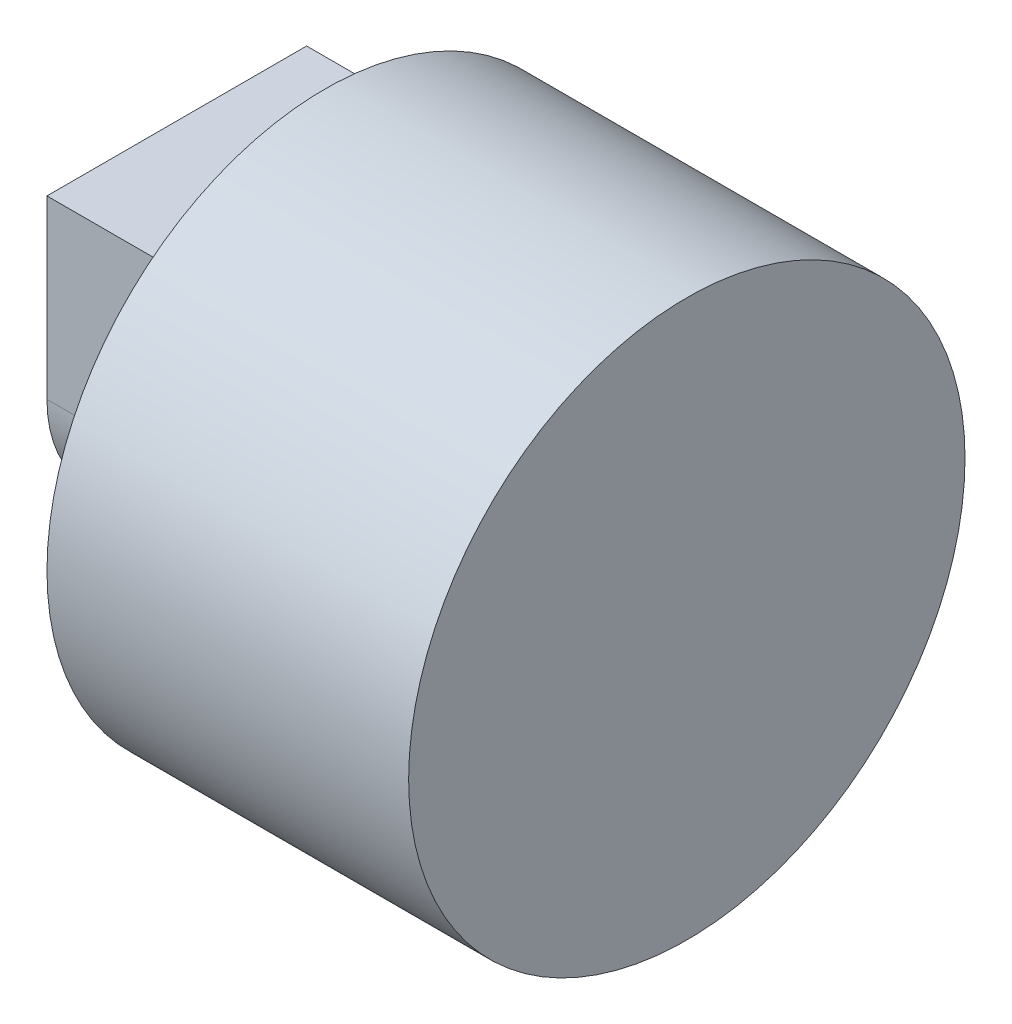
ISO-10303-21;
HEADER;
FILE_DESCRIPTION(('STEP AP214'),'2;1');
FILE_NAME('part.step','',(''),(''),'','','');
FILE_SCHEMA(('AUTOMOTIVE_DESIGN { 1 0 10303 214 1 1 1 1 }'));
ENDSEC;
DATA;
#1=APPLICATION_CONTEXT('core data for automotive mechanical design processes');
#2=APPLICATION_PROTOCOL_DEFINITION('international standard','automotive_design',2000,#1);
#3=PRODUCT_CONTEXT('',#1,'mechanical');
#4=PRODUCT('Part','Part','',(#3));
#5=PRODUCT_RELATED_PRODUCT_CATEGORY('part','',(#4));
#6=PRODUCT_DEFINITION_FORMATION('','',#4);
#7=PRODUCT_DEFINITION_CONTEXT('part definition',#1,'design');
#8=PRODUCT_DEFINITION('design','',#6,#7);
#9=PRODUCT_DEFINITION_SHAPE('','',#8);
#10=(LENGTH_UNIT() NAMED_UNIT(*) SI_UNIT(.MILLI.,.METRE.));
#11=(NAMED_UNIT(*) PLANE_ANGLE_UNIT() SI_UNIT($,.RADIAN.));
#12=(NAMED_UNIT(*) SI_UNIT($,.STERADIAN.) SOLID_ANGLE_UNIT());
#13=UNCERTAINTY_MEASURE_WITH_UNIT(LENGTH_MEASURE(1.E-05),#10,'distance_accuracy_value','');
#14=(GEOMETRIC_REPRESENTATION_CONTEXT(3) GLOBAL_UNCERTAINTY_ASSIGNED_CONTEXT((#13)) GLOBAL_UNIT_ASSIGNED_CONTEXT((#10,
#11,#12)) REPRESENTATION_CONTEXT('',''));
#15=CARTESIAN_POINT('',(0.,0.,0.));
#16=DIRECTION('',(0.,0.,1.));
#17=DIRECTION('',(1.,0.,0.));
#18=AXIS2_PLACEMENT_3D('',#15,#16,#17);
#19=CARTESIAN_POINT('',(0.,0.,0.));
#20=DIRECTION('',(1.,0.,0.));
#21=DIRECTION('',(0.,0.,-1.));
#22=AXIS2_PLACEMENT_3D('',#19,#20,#21);
#23=PLANE('',#22);
#24=CARTESIAN_POINT('',(0.,0.,0.));
#25=DIRECTION('',(-1.,0.,0.));
#26=DIRECTION('',(0.,0.,1.));
#27=AXIS2_PLACEMENT_3D('',#24,#25,#26);
#28=CIRCLE('',#27,3.);
#29=CARTESIAN_POINT('',(0.,0.,3.));
#30=VERTEX_POINT('',#29);
#31=CARTESIAN_POINT('',(0.,0.,-3.));
#32=VERTEX_POINT('',#31);
#33=EDGE_CURVE('E102',#30,#32,#28,.T.);
#34=ORIENTED_EDGE('',*,*,#33,.F.);
#35=DIRECTION('',(0.,1.,0.));
#36=VECTOR('',#35,1.);
#37=CARTESIAN_POINT('',(0.,0.,3.));
#38=LINE('',#37,#36);
#39=CARTESIAN_POINT('',(0.,5.5,3.));
#40=VERTEX_POINT('',#39);
#41=EDGE_CURVE('E105',#30,#40,#38,.T.);
#42=ORIENTED_EDGE('',*,*,#41,.T.);
#43=DIRECTION('',(0.,0.,-1.));
#44=VECTOR('',#43,1.);
#45=CARTESIAN_POINT('',(0.,5.5,-3.));
#46=LINE('',#45,#44);
#47=CARTESIAN_POINT('',(0.,5.5,-3.));
#48=VERTEX_POINT('',#47);
#49=EDGE_CURVE('E124',#40,#48,#46,.T.);
#50=ORIENTED_EDGE('',*,*,#49,.T.);
#51=DIRECTION('',(0.,-1.,0.));
#52=VECTOR('',#51,1.);
#53=CARTESIAN_POINT('',(0.,0.,-3.));
#54=LINE('',#53,#52);
#55=EDGE_CURVE('E107',#48,#32,#54,.T.);
#56=ORIENTED_EDGE('',*,*,#55,.T.);
#57=EDGE_LOOP('',(#34,#42,#50,#56));
#58=FACE_BOUND('',#57,.T.);
#59=ADVANCED_FACE('F39',(#58),#23,.F.);
#60=CARTESIAN_POINT('',(0.,0.,0.));
#61=DIRECTION('',(-1.,0.,0.));
#62=DIRECTION('',(0.,0.,1.));
#63=AXIS2_PLACEMENT_3D('',#60,#61,#62);
#64=CIRCLE('',#63,15.);
#65=CARTESIAN_POINT('',(0.,0.,15.));
#66=VERTEX_POINT('',#65);
#67=EDGE_CURVE('E11',#66,#66,#64,.T.);
#68=ORIENTED_EDGE('',*,*,#67,.T.);
#69=EDGE_LOOP('',(#68));
#70=FACE_BOUND('',#69,.T.);
#71=CARTESIAN_POINT('',(0.,0.,0.));
#72=DIRECTION('',(-1.,0.,0.));
#73=DIRECTION('',(0.,0.,1.));
#74=AXIS2_PLACEMENT_3D('',#71,#72,#73);
#75=CIRCLE('',#74,7.);
#76=CARTESIAN_POINT('',(0.,0.,-7.));
#77=VERTEX_POINT('',#76);
#78=CARTESIAN_POINT('',(0.,0.,7.));
#79=VERTEX_POINT('',#78);
#80=EDGE_CURVE('E131',#77,#79,#75,.T.);
#81=ORIENTED_EDGE('',*,*,#80,.F.);
#82=DIRECTION('',(0.,-1.,0.));
#83=VECTOR('',#82,1.);
#84=CARTESIAN_POINT('',(0.,0.,-7.));
#85=LINE('',#84,#83);
#86=CARTESIAN_POINT('',(0.,9.5,-7.));
#87=VERTEX_POINT('',#86);
#88=EDGE_CURVE('E146',#87,#77,#85,.T.);
#89=ORIENTED_EDGE('',*,*,#88,.F.);
#90=DIRECTION('',(0.,0.,-1.));
#91=VECTOR('',#90,1.);
#92=CARTESIAN_POINT('',(0.,9.5,-7.));
#93=LINE('',#92,#91);
#94=CARTESIAN_POINT('',(0.,9.5,7.));
#95=VERTEX_POINT('',#94);
#96=EDGE_CURVE('E59',#95,#87,#93,.T.);
#97=ORIENTED_EDGE('',*,*,#96,.F.);
#98=DIRECTION('',(0.,1.,0.));
#99=VECTOR('',#98,1.);
#100=CARTESIAN_POINT('',(0.,0.,7.));
#101=LINE('',#100,#99);
#102=EDGE_CURVE('E54',#79,#95,#101,.T.);
#103=ORIENTED_EDGE('',*,*,#102,.F.);
#104=EDGE_LOOP('',(#81,#89,#97,#103));
#105=FACE_BOUND('',#104,.T.);
#106=ADVANCED_FACE('F193',(#70,#105),#23,.F.);
#107=CARTESIAN_POINT('',(0.,0.,0.));
#108=DIRECTION('',(-1.,0.,0.));
#109=DIRECTION('',(0.,0.,1.));
#110=AXIS2_PLACEMENT_3D('',#107,#108,#109);
#111=CYLINDRICAL_SURFACE('',#110,15.);
#112=ORIENTED_EDGE('',*,*,#67,.F.);
#113=EDGE_LOOP('',(#112));
#114=FACE_BOUND('',#113,.T.);
#115=CARTESIAN_POINT('',(19.5,0.,0.));
#116=DIRECTION('',(-1.,0.,0.));
#117=DIRECTION('',(0.,0.,1.));
#118=AXIS2_PLACEMENT_3D('',#115,#116,#117);
#119=CIRCLE('',#118,15.);
#120=CARTESIAN_POINT('',(19.5,0.,15.));
#121=VERTEX_POINT('',#120);
#122=EDGE_CURVE('E47',#121,#121,#119,.T.);
#123=ORIENTED_EDGE('',*,*,#122,.T.);
#124=EDGE_LOOP('',(#123));
#125=FACE_BOUND('',#124,.T.);
#126=ADVANCED_FACE('F180',(#114,#125),#111,.T.);
#127=CARTESIAN_POINT('',(19.5,15.,0.));
#128=DIRECTION('',(-1.,0.,0.));
#129=DIRECTION('',(0.,0.,1.));
#130=AXIS2_PLACEMENT_3D('',#127,#128,#129);
#131=PLANE('',#130);
#132=ORIENTED_EDGE('',*,*,#122,.F.);
#133=EDGE_LOOP('',(#132));
#134=FACE_BOUND('',#133,.T.);
#135=ADVANCED_FACE('F182',(#134),#131,.F.);
#136=CARTESIAN_POINT('',(-8.,0.,0.));
#137=DIRECTION('',(-1.,0.,0.));
#138=DIRECTION('',(0.,0.,1.));
#139=AXIS2_PLACEMENT_3D('',#136,#137,#138);
#140=PLANE('',#139);
#141=CARTESIAN_POINT('',(-8.,0.,0.));
#142=DIRECTION('',(-1.,0.,0.));
#143=DIRECTION('',(0.,0.,1.));
#144=AXIS2_PLACEMENT_3D('',#141,#142,#143);
#145=CIRCLE('',#144,7.);
#146=CARTESIAN_POINT('',(-8.,0.,-7.));
#147=VERTEX_POINT('',#146);
#148=CARTESIAN_POINT('',(-8.,0.,7.));
#149=VERTEX_POINT('',#148);
#150=EDGE_CURVE('E141',#147,#149,#145,.T.);
#151=ORIENTED_EDGE('',*,*,#150,.T.);
#152=DIRECTION('',(0.,1.,0.));
#153=VECTOR('',#152,1.);
#154=CARTESIAN_POINT('',(-8.,0.,7.));
#155=LINE('',#154,#153);
#156=CARTESIAN_POINT('',(-8.,9.5,7.));
#157=VERTEX_POINT('',#156);
#158=EDGE_CURVE('E145',#149,#157,#155,.T.);
#159=ORIENTED_EDGE('',*,*,#158,.T.);
#160=DIRECTION('',(0.,0.,-1.));
#161=VECTOR('',#160,1.);
#162=CARTESIAN_POINT('',(-8.,9.5,-7.));
#163=LINE('',#162,#161);
#164=CARTESIAN_POINT('',(-8.,9.5,-7.));
#165=VERTEX_POINT('',#164);
#166=EDGE_CURVE('E149',#157,#165,#163,.T.);
#167=ORIENTED_EDGE('',*,*,#166,.T.);
#168=DIRECTION('',(0.,-1.,0.));
#169=VECTOR('',#168,1.);
#170=CARTESIAN_POINT('',(-8.,0.,-7.));
#171=LINE('',#170,#169);
#172=EDGE_CURVE('E152',#165,#147,#171,.T.);
#173=ORIENTED_EDGE('',*,*,#172,.T.);
#174=EDGE_LOOP('',(#151,#159,#167,#173));
#175=FACE_BOUND('',#174,.T.);
#176=DIRECTION('',(0.,1.,0.));
#177=VECTOR('',#176,1.);
#178=CARTESIAN_POINT('',(-8.,0.,3.));
#179=LINE('',#178,#177);
#180=CARTESIAN_POINT('',(-8.,0.,3.));
#181=VERTEX_POINT('',#180);
#182=CARTESIAN_POINT('',(-8.,5.5,3.));
#183=VERTEX_POINT('',#182);
#184=EDGE_CURVE('E253',#181,#183,#179,.T.);
#185=ORIENTED_EDGE('',*,*,#184,.F.);
#186=CARTESIAN_POINT('',(-8.,0.,0.));
#187=DIRECTION('',(-1.,0.,0.));
#188=DIRECTION('',(0.,0.,1.));
#189=AXIS2_PLACEMENT_3D('',#186,#187,#188);
#190=CIRCLE('',#189,3.);
#191=CARTESIAN_POINT('',(-8.,0.,-3.));
#192=VERTEX_POINT('',#191);
#193=EDGE_CURVE('E129',#192,#181,#190,.T.);
#194=ORIENTED_EDGE('',*,*,#193,.F.);
#195=DIRECTION('',(0.,-1.,0.));
#196=VECTOR('',#195,1.);
#197=CARTESIAN_POINT('',(-8.,0.,-3.));
#198=LINE('',#197,#196);
#199=CARTESIAN_POINT('',(-8.,5.5,-3.));
#200=VERTEX_POINT('',#199);
#201=EDGE_CURVE('E260',#200,#192,#198,.T.);
#202=ORIENTED_EDGE('',*,*,#201,.F.);
#203=DIRECTION('',(0.,0.,-1.));
#204=VECTOR('',#203,1.);
#205=CARTESIAN_POINT('',(-8.,5.5,-3.));
#206=LINE('',#205,#204);
#207=EDGE_CURVE('E256',#183,#200,#206,.T.);
#208=ORIENTED_EDGE('',*,*,#207,.F.);
#209=EDGE_LOOP('',(#185,#194,#202,#208));
#210=FACE_BOUND('',#209,.T.);
#211=ADVANCED_FACE('F184',(#175,#210),#140,.T.);
#212=CARTESIAN_POINT('',(-8.,0.,0.));
#213=DIRECTION('',(1.,0.,0.));
#214=DIRECTION('',(0.,0.,-1.));
#215=AXIS2_PLACEMENT_3D('',#212,#213,#214);
#216=CYLINDRICAL_SURFACE('',#215,7.);
#217=ORIENTED_EDGE('',*,*,#80,.T.);
#218=DIRECTION('',(1.,0.,0.));
#219=VECTOR('',#218,1.);
#220=CARTESIAN_POINT('',(-8.,0.,7.));
#221=LINE('',#220,#219);
#222=EDGE_CURVE('E174',#149,#79,#221,.T.);
#223=ORIENTED_EDGE('',*,*,#222,.F.);
#224=ORIENTED_EDGE('',*,*,#150,.F.);
#225=DIRECTION('',(1.,0.,0.));
#226=VECTOR('',#225,1.);
#227=CARTESIAN_POINT('',(-8.,0.,-7.));
#228=LINE('',#227,#226);
#229=EDGE_CURVE('E154',#147,#77,#228,.T.);
#230=ORIENTED_EDGE('',*,*,#229,.T.);
#231=EDGE_LOOP('',(#217,#223,#224,#230));
#232=FACE_BOUND('',#231,.T.);
#233=ADVANCED_FACE('F190',(#232),#216,.T.);
#234=CARTESIAN_POINT('',(-8.,0.,7.));
#235=DIRECTION('',(0.,0.,-1.));
#236=DIRECTION('',(0.,1.,0.));
#237=AXIS2_PLACEMENT_3D('',#234,#235,#236);
#238=PLANE('',#237);
#239=ORIENTED_EDGE('',*,*,#102,.T.);
#240=DIRECTION('',(1.,0.,0.));
#241=VECTOR('',#240,1.);
#242=CARTESIAN_POINT('',(-8.,9.5,7.));
#243=LINE('',#242,#241);
#244=EDGE_CURVE('E170',#157,#95,#243,.T.);
#245=ORIENTED_EDGE('',*,*,#244,.F.);
#246=ORIENTED_EDGE('',*,*,#158,.F.);
#247=ORIENTED_EDGE('',*,*,#222,.T.);
#248=EDGE_LOOP('',(#239,#245,#246,#247));
#249=FACE_BOUND('',#248,.T.);
#250=ADVANCED_FACE('F218',(#249),#238,.F.);
#251=CARTESIAN_POINT('',(-8.,9.5,-7.));
#252=DIRECTION('',(0.,-1.,0.));
#253=DIRECTION('',(0.,0.,-1.));
#254=AXIS2_PLACEMENT_3D('',#251,#252,#253);
#255=PLANE('',#254);
#256=ORIENTED_EDGE('',*,*,#96,.T.);
#257=DIRECTION('',(1.,0.,0.));
#258=VECTOR('',#257,1.);
#259=CARTESIAN_POINT('',(-8.,9.5,-7.));
#260=LINE('',#259,#258);
#261=EDGE_CURVE('E166',#165,#87,#260,.T.);
#262=ORIENTED_EDGE('',*,*,#261,.F.);
#263=ORIENTED_EDGE('',*,*,#166,.F.);
#264=ORIENTED_EDGE('',*,*,#244,.T.);
#265=EDGE_LOOP('',(#256,#262,#263,#264));
#266=FACE_BOUND('',#265,.T.);
#267=ADVANCED_FACE('F216',(#266),#255,.F.);
#268=CARTESIAN_POINT('',(-8.,0.,-7.));
#269=DIRECTION('',(0.,0.,1.));
#270=DIRECTION('',(0.,-1.,0.));
#271=AXIS2_PLACEMENT_3D('',#268,#269,#270);
#272=PLANE('',#271);
#273=ORIENTED_EDGE('',*,*,#88,.T.);
#274=ORIENTED_EDGE('',*,*,#229,.F.);
#275=ORIENTED_EDGE('',*,*,#172,.F.);
#276=ORIENTED_EDGE('',*,*,#261,.T.);
#277=EDGE_LOOP('',(#273,#274,#275,#276));
#278=FACE_BOUND('',#277,.T.);
#279=ADVANCED_FACE('F208',(#278),#272,.F.);
#280=CARTESIAN_POINT('',(-8.,0.,0.));
#281=DIRECTION('',(1.,0.,0.));
#282=DIRECTION('',(0.,0.,-1.));
#283=AXIS2_PLACEMENT_3D('',#280,#281,#282);
#284=CYLINDRICAL_SURFACE('',#283,3.);
#285=DIRECTION('',(1.,0.,0.));
#286=VECTOR('',#285,1.);
#287=CARTESIAN_POINT('',(-8.,0.,3.));
#288=LINE('',#287,#286);
#289=EDGE_CURVE('E118',#181,#30,#288,.T.);
#290=ORIENTED_EDGE('',*,*,#289,.T.);
#291=ORIENTED_EDGE('',*,*,#33,.T.);
#292=DIRECTION('',(1.,0.,0.));
#293=VECTOR('',#292,1.);
#294=CARTESIAN_POINT('',(-8.,0.,-3.));
#295=LINE('',#294,#293);
#296=EDGE_CURVE('E262',#192,#32,#295,.T.);
#297=ORIENTED_EDGE('',*,*,#296,.F.);
#298=ORIENTED_EDGE('',*,*,#193,.T.);
#299=EDGE_LOOP('',(#290,#291,#297,#298));
#300=FACE_BOUND('',#299,.T.);
#301=CARTESIAN_POINT('',(10.,0.,0.));
#302=DIRECTION('',(-1.,0.,0.));
#303=DIRECTION('',(0.,0.,1.));
#304=AXIS2_PLACEMENT_3D('',#301,#302,#303);
#305=CIRCLE('',#304,3.);
#306=CARTESIAN_POINT('',(10.,0.,3.));
#307=VERTEX_POINT('',#306);
#308=EDGE_CURVE('E113',#307,#307,#305,.T.);
#309=ORIENTED_EDGE('',*,*,#308,.F.);
#310=EDGE_LOOP('',(#309));
#311=FACE_BOUND('',#310,.T.);
#312=ADVANCED_FACE('F126',(#300,#311),#284,.F.);
#313=CARTESIAN_POINT('',(-8.,0.,3.));
#314=DIRECTION('',(0.,0.,-1.));
#315=DIRECTION('',(0.,1.,0.));
#316=AXIS2_PLACEMENT_3D('',#313,#314,#315);
#317=PLANE('',#316);
#318=ORIENTED_EDGE('',*,*,#41,.F.);
#319=ORIENTED_EDGE('',*,*,#289,.F.);
#320=ORIENTED_EDGE('',*,*,#184,.T.);
#321=DIRECTION('',(1.,0.,0.));
#322=VECTOR('',#321,1.);
#323=CARTESIAN_POINT('',(-8.,5.5,3.));
#324=LINE('',#323,#322);
#325=EDGE_CURVE('E121',#183,#40,#324,.T.);
#326=ORIENTED_EDGE('',*,*,#325,.T.);
#327=EDGE_LOOP('',(#318,#319,#320,#326));
#328=FACE_BOUND('',#327,.T.);
#329=ADVANCED_FACE('F117',(#328),#317,.T.);
#330=CARTESIAN_POINT('',(-8.,5.5,-3.));
#331=DIRECTION('',(0.,-1.,0.));
#332=DIRECTION('',(0.,0.,-1.));
#333=AXIS2_PLACEMENT_3D('',#330,#331,#332);
#334=PLANE('',#333);
#335=ORIENTED_EDGE('',*,*,#49,.F.);
#336=ORIENTED_EDGE('',*,*,#325,.F.);
#337=ORIENTED_EDGE('',*,*,#207,.T.);
#338=DIRECTION('',(1.,0.,0.));
#339=VECTOR('',#338,1.);
#340=CARTESIAN_POINT('',(-8.,5.5,-3.));
#341=LINE('',#340,#339);
#342=EDGE_CURVE('E137',#200,#48,#341,.T.);
#343=ORIENTED_EDGE('',*,*,#342,.T.);
#344=EDGE_LOOP('',(#335,#336,#337,#343));
#345=FACE_BOUND('',#344,.T.);
#346=ADVANCED_FACE('F233',(#345),#334,.T.);
#347=CARTESIAN_POINT('',(-8.,0.,-3.));
#348=DIRECTION('',(0.,0.,1.));
#349=DIRECTION('',(0.,-1.,0.));
#350=AXIS2_PLACEMENT_3D('',#347,#348,#349);
#351=PLANE('',#350);
#352=ORIENTED_EDGE('',*,*,#55,.F.);
#353=ORIENTED_EDGE('',*,*,#342,.F.);
#354=ORIENTED_EDGE('',*,*,#201,.T.);
#355=ORIENTED_EDGE('',*,*,#296,.T.);
#356=EDGE_LOOP('',(#352,#353,#354,#355));
#357=FACE_BOUND('',#356,.T.);
#358=ADVANCED_FACE('F236',(#357),#351,.T.);
#359=CARTESIAN_POINT('',(10.,0.,0.));
#360=DIRECTION('',(-1.,0.,0.));
#361=DIRECTION('',(0.,0.,1.));
#362=AXIS2_PLACEMENT_3D('',#359,#360,#361);
#363=PLANE('',#362);
#364=ORIENTED_EDGE('',*,*,#308,.T.);
#365=EDGE_LOOP('',(#364));
#366=FACE_BOUND('',#365,.T.);
#367=ADVANCED_FACE('F240',(#366),#363,.T.);
#368=CLOSED_SHELL('',(#59,#106,#126,#135,#211,#233,#250,#267,#279,#312,#329,#346,#358,#367));
#369=MANIFOLD_SOLID_BREP('B2',#368);
#370=ADVANCED_BREP_SHAPE_REPRESENTATION('',(#18,#369),#14);
#371=SHAPE_DEFINITION_REPRESENTATION(#9,#370);
ENDSEC;
END-ISO-10303-21;
